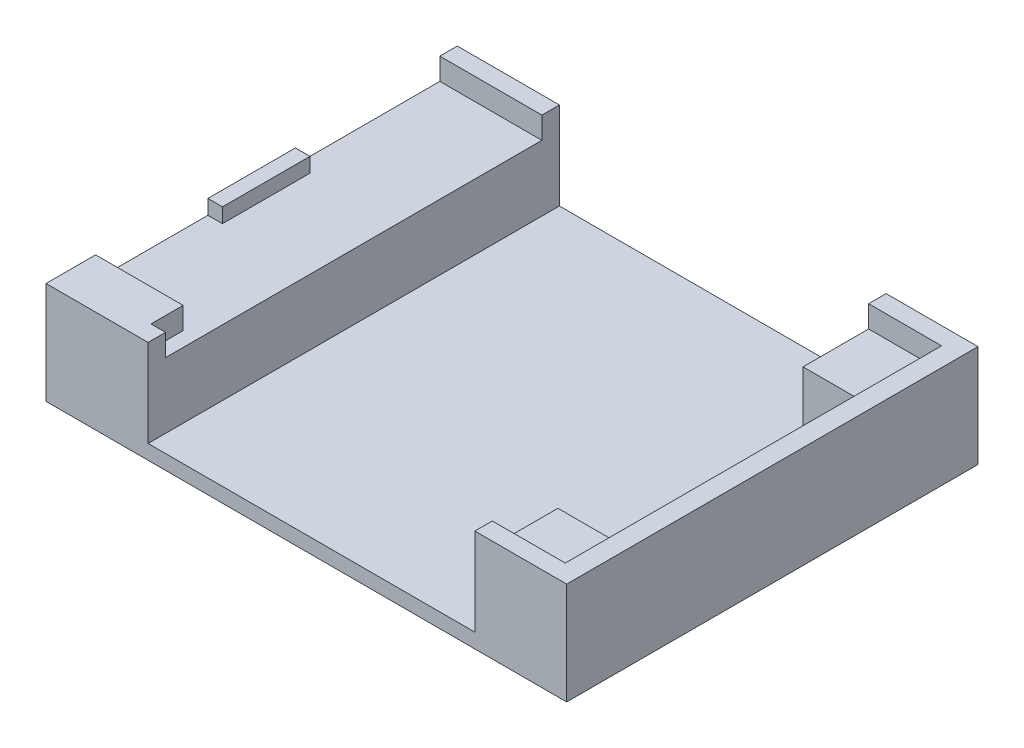
ISO-10303-21;
HEADER;
FILE_DESCRIPTION(('STEP AP214'),'2;1');
FILE_NAME('part.step','',(''),(''),'','','');
FILE_SCHEMA(('AUTOMOTIVE_DESIGN { 1 0 10303 214 1 1 1 1 }'));
ENDSEC;
DATA;
#1=APPLICATION_CONTEXT('core data for automotive mechanical design processes');
#2=APPLICATION_PROTOCOL_DEFINITION('international standard','automotive_design',2000,#1);
#3=PRODUCT_CONTEXT('',#1,'mechanical');
#4=PRODUCT('Part','Part','',(#3));
#5=PRODUCT_RELATED_PRODUCT_CATEGORY('part','',(#4));
#6=PRODUCT_DEFINITION_FORMATION('','',#4);
#7=PRODUCT_DEFINITION_CONTEXT('part definition',#1,'design');
#8=PRODUCT_DEFINITION('design','',#6,#7);
#9=PRODUCT_DEFINITION_SHAPE('','',#8);
#10=(LENGTH_UNIT() NAMED_UNIT(*) SI_UNIT(.MILLI.,.METRE.));
#11=(NAMED_UNIT(*) PLANE_ANGLE_UNIT() SI_UNIT($,.RADIAN.));
#12=(NAMED_UNIT(*) SI_UNIT($,.STERADIAN.) SOLID_ANGLE_UNIT());
#13=UNCERTAINTY_MEASURE_WITH_UNIT(LENGTH_MEASURE(1.E-05),#10,'distance_accuracy_value','');
#14=(GEOMETRIC_REPRESENTATION_CONTEXT(3) GLOBAL_UNCERTAINTY_ASSIGNED_CONTEXT((#13)) GLOBAL_UNIT_ASSIGNED_CONTEXT((#10,
#11,#12)) REPRESENTATION_CONTEXT('',''));
#15=CARTESIAN_POINT('',(0.,0.,0.));
#16=DIRECTION('',(0.,0.,1.));
#17=DIRECTION('',(1.,0.,0.));
#18=AXIS2_PLACEMENT_3D('',#15,#16,#17);
#19=CARTESIAN_POINT('',(0.,5.5,0.));
#20=DIRECTION('',(0.,1.,0.));
#21=DIRECTION('',(0.,0.,1.));
#22=AXIS2_PLACEMENT_3D('',#19,#20,#21);
#23=PLANE('',#22);
#24=DIRECTION('',(-1.,0.,0.));
#25=VECTOR('',#24,1.);
#26=CARTESIAN_POINT('',(-11.85,5.5,10.7));
#27=LINE('',#26,#25);
#28=CARTESIAN_POINT('',(-11.85,5.5,10.7));
#29=VERTEX_POINT('',#28);
#30=CARTESIAN_POINT('',(-17.85,5.5,10.7));
#31=VERTEX_POINT('',#30);
#32=EDGE_CURVE('E81',#29,#31,#27,.T.);
#33=ORIENTED_EDGE('',*,*,#32,.F.);
#34=DIRECTION('',(0.,0.,-1.));
#35=VECTOR('',#34,1.);
#36=CARTESIAN_POINT('',(-11.85,5.5,12.9));
#37=LINE('',#36,#35);
#38=CARTESIAN_POINT('',(-11.85,5.5,12.9));
#39=VERTEX_POINT('',#38);
#40=EDGE_CURVE('E85',#39,#29,#37,.T.);
#41=ORIENTED_EDGE('',*,*,#40,.F.);
#42=DIRECTION('',(1.,0.,0.));
#43=VECTOR('',#42,1.);
#44=CARTESIAN_POINT('',(-17.85,5.5,12.9));
#45=LINE('',#44,#43);
#46=CARTESIAN_POINT('',(-10.85,5.5,12.9));
#47=VERTEX_POINT('',#46);
#48=EDGE_CURVE('E368',#39,#47,#45,.T.);
#49=ORIENTED_EDGE('',*,*,#48,.T.);
#50=DIRECTION('',(0.,0.,1.));
#51=VECTOR('',#50,1.);
#52=CARTESIAN_POINT('',(-10.85,5.5,-12.9));
#53=LINE('',#52,#51);
#54=CARTESIAN_POINT('',(-10.85,5.5,-12.9));
#55=VERTEX_POINT('',#54);
#56=EDGE_CURVE('E327',#55,#47,#53,.T.);
#57=ORIENTED_EDGE('',*,*,#56,.F.);
#58=DIRECTION('',(-1.,0.,0.));
#59=VECTOR('',#58,1.);
#60=CARTESIAN_POINT('',(-17.85,5.5,-12.9));
#61=LINE('',#60,#59);
#62=CARTESIAN_POINT('',(-17.85,5.5,-12.9));
#63=VERTEX_POINT('',#62);
#64=EDGE_CURVE('E374',#55,#63,#61,.T.);
#65=ORIENTED_EDGE('',*,*,#64,.T.);
#66=DIRECTION('',(0.,0.,1.));
#67=VECTOR('',#66,1.);
#68=CARTESIAN_POINT('',(-17.85,5.5,-12.9));
#69=LINE('',#68,#67);
#70=CARTESIAN_POINT('',(-17.85,5.5,-3.));
#71=VERTEX_POINT('',#70);
#72=EDGE_CURVE('E363',#63,#71,#69,.T.);
#73=ORIENTED_EDGE('',*,*,#72,.T.);
#74=DIRECTION('',(-1.,0.,0.));
#75=VECTOR('',#74,1.);
#76=CARTESIAN_POINT('',(-17.85,5.5,-3.));
#77=LINE('',#76,#75);
#78=CARTESIAN_POINT('',(-16.85,5.5,-3.));
#79=VERTEX_POINT('',#78);
#80=EDGE_CURVE('E269',#79,#71,#77,.T.);
#81=ORIENTED_EDGE('',*,*,#80,.F.);
#82=DIRECTION('',(0.,0.,-1.));
#83=VECTOR('',#82,1.);
#84=CARTESIAN_POINT('',(-16.85,5.5,-3.));
#85=LINE('',#84,#83);
#86=CARTESIAN_POINT('',(-16.85,5.5,3.));
#87=VERTEX_POINT('',#86);
#88=EDGE_CURVE('E277',#87,#79,#85,.T.);
#89=ORIENTED_EDGE('',*,*,#88,.F.);
#90=DIRECTION('',(1.,0.,0.));
#91=VECTOR('',#90,1.);
#92=CARTESIAN_POINT('',(-17.85,5.5,3.));
#93=LINE('',#92,#91);
#94=CARTESIAN_POINT('',(-17.85,5.5,3.));
#95=VERTEX_POINT('',#94);
#96=EDGE_CURVE('E264',#95,#87,#93,.T.);
#97=ORIENTED_EDGE('',*,*,#96,.F.);
#98=EDGE_CURVE('E367',#95,#31,#69,.T.);
#99=ORIENTED_EDGE('',*,*,#98,.T.);
#100=EDGE_LOOP('',(#33,#41,#49,#57,#65,#73,#81,#89,#97,#99));
#101=FACE_BOUND('',#100,.T.);
#102=ADVANCED_FACE('F66',(#101),#23,.T.);
#103=CARTESIAN_POINT('',(-17.85,5.5,12.9));
#104=DIRECTION('',(0.,0.,1.));
#105=DIRECTION('',(1.,0.,0.));
#106=AXIS2_PLACEMENT_3D('',#103,#104,#105);
#107=PLANE('',#106);
#108=DIRECTION('',(0.,-1.,0.));
#109=VECTOR('',#108,1.);
#110=CARTESIAN_POINT('',(-11.85,7.,12.9));
#111=LINE('',#110,#109);
#112=CARTESIAN_POINT('',(-11.85,7.,12.9));
#113=VERTEX_POINT('',#112);
#114=EDGE_CURVE('E253',#113,#39,#111,.T.);
#115=ORIENTED_EDGE('',*,*,#114,.F.);
#116=DIRECTION('',(1.,0.,0.));
#117=VECTOR('',#116,1.);
#118=CARTESIAN_POINT('',(-17.85,7.,12.9));
#119=LINE('',#118,#117);
#120=CARTESIAN_POINT('',(-10.85,7.,12.9));
#121=VERTEX_POINT('',#120);
#122=EDGE_CURVE('E245',#113,#121,#119,.T.);
#123=ORIENTED_EDGE('',*,*,#122,.T.);
#124=DIRECTION('',(0.,1.,0.));
#125=VECTOR('',#124,1.);
#126=CARTESIAN_POINT('',(-10.85,-21.4321198284959,12.9));
#127=LINE('',#126,#125);
#128=EDGE_CURVE('E314',#47,#121,#127,.T.);
#129=ORIENTED_EDGE('',*,*,#128,.F.);
#130=ORIENTED_EDGE('',*,*,#48,.F.);
#131=EDGE_LOOP('',(#115,#123,#129,#130));
#132=FACE_BOUND('',#131,.T.);
#133=ADVANCED_FACE('F492',(#132),#107,.F.);
#134=CARTESIAN_POINT('',(-17.85,7.,-14.1));
#135=DIRECTION('',(0.,0.,1.));
#136=DIRECTION('',(1.,0.,0.));
#137=AXIS2_PLACEMENT_3D('',#134,#135,#136);
#138=PLANE('',#137);
#139=DIRECTION('',(0.,1.,0.));
#140=VECTOR('',#139,1.);
#141=CARTESIAN_POINT('',(11.55,-21.4321198284959,-14.1));
#142=LINE('',#141,#140);
#143=CARTESIAN_POINT('',(11.55,1.,-14.1));
#144=VERTEX_POINT('',#143);
#145=CARTESIAN_POINT('',(11.55,7.,-14.1));
#146=VERTEX_POINT('',#145);
#147=EDGE_CURVE('E303',#144,#146,#142,.T.);
#148=ORIENTED_EDGE('',*,*,#147,.T.);
#149=DIRECTION('',(-1.,0.,0.));
#150=VECTOR('',#149,1.);
#151=CARTESIAN_POINT('',(-17.85,7.,-14.1));
#152=LINE('',#151,#150);
#153=CARTESIAN_POINT('',(17.85,7.,-14.1));
#154=VERTEX_POINT('',#153);
#155=EDGE_CURVE('E400',#154,#146,#152,.T.);
#156=ORIENTED_EDGE('',*,*,#155,.F.);
#157=DIRECTION('',(0.,-1.,0.));
#158=VECTOR('',#157,1.);
#159=CARTESIAN_POINT('',(17.85,7.,-14.1));
#160=LINE('',#159,#158);
#161=CARTESIAN_POINT('',(17.85,0.,-14.1));
#162=VERTEX_POINT('',#161);
#163=EDGE_CURVE('E13',#154,#162,#160,.T.);
#164=ORIENTED_EDGE('',*,*,#163,.T.);
#165=DIRECTION('',(-1.,0.,0.));
#166=VECTOR('',#165,1.);
#167=CARTESIAN_POINT('',(-17.85,0.,-14.1));
#168=LINE('',#167,#166);
#169=CARTESIAN_POINT('',(-17.85,0.,-14.1));
#170=VERTEX_POINT('',#169);
#171=EDGE_CURVE('E414',#162,#170,#168,.T.);
#172=ORIENTED_EDGE('',*,*,#171,.T.);
#173=DIRECTION('',(0.,-1.,0.));
#174=VECTOR('',#173,1.);
#175=CARTESIAN_POINT('',(-17.85,7.,-14.1));
#176=LINE('',#175,#174);
#177=CARTESIAN_POINT('',(-17.85,7.,-14.1));
#178=VERTEX_POINT('',#177);
#179=EDGE_CURVE('E74',#178,#170,#176,.T.);
#180=ORIENTED_EDGE('',*,*,#179,.F.);
#181=CARTESIAN_POINT('',(-10.85,7.,-14.1));
#182=VERTEX_POINT('',#181);
#183=EDGE_CURVE('E398',#182,#178,#152,.T.);
#184=ORIENTED_EDGE('',*,*,#183,.F.);
#185=DIRECTION('',(0.,1.,0.));
#186=VECTOR('',#185,1.);
#187=CARTESIAN_POINT('',(-10.85,-21.4321198284959,-14.1));
#188=LINE('',#187,#186);
#189=CARTESIAN_POINT('',(-10.85,1.,-14.1));
#190=VERTEX_POINT('',#189);
#191=EDGE_CURVE('E295',#190,#182,#188,.T.);
#192=ORIENTED_EDGE('',*,*,#191,.F.);
#193=DIRECTION('',(-1.,0.,0.));
#194=VECTOR('',#193,1.);
#195=CARTESIAN_POINT('',(-10.85,1.,-14.1));
#196=LINE('',#195,#194);
#197=EDGE_CURVE('E291',#144,#190,#196,.T.);
#198=ORIENTED_EDGE('',*,*,#197,.F.);
#199=EDGE_LOOP('',(#148,#156,#164,#172,#180,#184,#192,#198));
#200=FACE_BOUND('',#199,.T.);
#201=ADVANCED_FACE('F489',(#200),#138,.F.);
#202=CARTESIAN_POINT('',(0.,7.,0.));
#203=DIRECTION('',(0.,1.,0.));
#204=DIRECTION('',(0.,0.,1.));
#205=AXIS2_PLACEMENT_3D('',#202,#203,#204);
#206=PLANE('',#205);
#207=ORIENTED_EDGE('',*,*,#155,.T.);
#208=DIRECTION('',(0.,0.,1.));
#209=VECTOR('',#208,1.);
#210=CARTESIAN_POINT('',(11.55,7.,-12.9));
#211=LINE('',#210,#209);
#212=CARTESIAN_POINT('',(11.55,7.,-12.9));
#213=VERTEX_POINT('',#212);
#214=EDGE_CURVE('E298',#146,#213,#211,.T.);
#215=ORIENTED_EDGE('',*,*,#214,.T.);
#216=DIRECTION('',(-1.,0.,0.));
#217=VECTOR('',#216,1.);
#218=CARTESIAN_POINT('',(-17.85,7.,-12.9));
#219=LINE('',#218,#217);
#220=CARTESIAN_POINT('',(16.55,7.,-12.9));
#221=VERTEX_POINT('',#220);
#222=EDGE_CURVE('E384',#221,#213,#219,.T.);
#223=ORIENTED_EDGE('',*,*,#222,.F.);
#224=DIRECTION('',(0.,0.,-1.));
#225=VECTOR('',#224,1.);
#226=CARTESIAN_POINT('',(16.55,7.,-12.9));
#227=LINE('',#226,#225);
#228=CARTESIAN_POINT('',(16.55,7.,12.9));
#229=VERTEX_POINT('',#228);
#230=EDGE_CURVE('E380',#229,#221,#227,.T.);
#231=ORIENTED_EDGE('',*,*,#230,.F.);
#232=CARTESIAN_POINT('',(11.55,7.,12.9));
#233=VERTEX_POINT('',#232);
#234=EDGE_CURVE('E362',#233,#229,#119,.T.);
#235=ORIENTED_EDGE('',*,*,#234,.F.);
#236=DIRECTION('',(0.,0.,-1.));
#237=VECTOR('',#236,1.);
#238=CARTESIAN_POINT('',(11.55,7.,12.9));
#239=LINE('',#238,#237);
#240=CARTESIAN_POINT('',(11.55,7.,14.1));
#241=VERTEX_POINT('',#240);
#242=EDGE_CURVE('E311',#241,#233,#239,.T.);
#243=ORIENTED_EDGE('',*,*,#242,.F.);
#244=DIRECTION('',(1.,0.,0.));
#245=VECTOR('',#244,1.);
#246=CARTESIAN_POINT('',(-17.85,7.,14.1));
#247=LINE('',#246,#245);
#248=CARTESIAN_POINT('',(17.85,7.,14.1));
#249=VERTEX_POINT('',#248);
#250=EDGE_CURVE('E407',#241,#249,#247,.T.);
#251=ORIENTED_EDGE('',*,*,#250,.T.);
#252=DIRECTION('',(0.,0.,-1.));
#253=VECTOR('',#252,1.);
#254=CARTESIAN_POINT('',(17.85,7.,-14.1));
#255=LINE('',#254,#253);
#256=EDGE_CURVE('E395',#249,#154,#255,.T.);
#257=ORIENTED_EDGE('',*,*,#256,.T.);
#258=EDGE_LOOP('',(#207,#215,#223,#231,#235,#243,#251,#257));
#259=FACE_BOUND('',#258,.T.);
#260=ADVANCED_FACE('F445',(#259),#206,.T.);
#261=CARTESIAN_POINT('',(-10.85,7.,-12.9));
#262=VERTEX_POINT('',#261);
#263=CARTESIAN_POINT('',(-17.85,7.,-12.9));
#264=VERTEX_POINT('',#263);
#265=EDGE_CURVE('E383',#262,#264,#219,.T.);
#266=ORIENTED_EDGE('',*,*,#265,.F.);
#267=DIRECTION('',(0.,0.,-1.));
#268=VECTOR('',#267,1.);
#269=CARTESIAN_POINT('',(-10.85,7.,-12.9));
#270=LINE('',#269,#268);
#271=EDGE_CURVE('E290',#262,#182,#270,.T.);
#272=ORIENTED_EDGE('',*,*,#271,.T.);
#273=ORIENTED_EDGE('',*,*,#183,.T.);
#274=DIRECTION('',(0.,0.,1.));
#275=VECTOR('',#274,1.);
#276=CARTESIAN_POINT('',(-17.85,7.,-14.1));
#277=LINE('',#276,#275);
#278=EDGE_CURVE('E404',#178,#264,#277,.T.);
#279=ORIENTED_EDGE('',*,*,#278,.T.);
#280=EDGE_LOOP('',(#266,#272,#273,#279));
#281=FACE_BOUND('',#280,.T.);
#282=ADVANCED_FACE('F488',(#281),#206,.T.);
#283=CARTESIAN_POINT('',(-17.85,5.5,-12.9));
#284=DIRECTION('',(0.,0.,-1.));
#285=DIRECTION('',(-1.,0.,0.));
#286=AXIS2_PLACEMENT_3D('',#283,#284,#285);
#287=PLANE('',#286);
#288=DIRECTION('',(0.,1.,0.));
#289=VECTOR('',#288,1.);
#290=CARTESIAN_POINT('',(11.55,-21.4321198284959,-12.9));
#291=LINE('',#290,#289);
#292=CARTESIAN_POINT('',(11.55,5.5,-12.9));
#293=VERTEX_POINT('',#292);
#294=EDGE_CURVE('E306',#293,#213,#291,.T.);
#295=ORIENTED_EDGE('',*,*,#294,.F.);
#296=CARTESIAN_POINT('',(16.55,5.5,-12.9));
#297=VERTEX_POINT('',#296);
#298=EDGE_CURVE('E375',#297,#293,#61,.T.);
#299=ORIENTED_EDGE('',*,*,#298,.F.);
#300=DIRECTION('',(0.,1.,0.));
#301=VECTOR('',#300,1.);
#302=CARTESIAN_POINT('',(16.55,5.5,-12.9));
#303=LINE('',#302,#301);
#304=EDGE_CURVE('E391',#297,#221,#303,.T.);
#305=ORIENTED_EDGE('',*,*,#304,.T.);
#306=ORIENTED_EDGE('',*,*,#222,.T.);
#307=EDGE_LOOP('',(#295,#299,#305,#306));
#308=FACE_BOUND('',#307,.T.);
#309=ADVANCED_FACE('F541',(#308),#287,.F.);
#310=DIRECTION('',(0.,1.,0.));
#311=VECTOR('',#310,1.);
#312=CARTESIAN_POINT('',(-10.85,-21.4321198284959,-12.9));
#313=LINE('',#312,#311);
#314=EDGE_CURVE('E301',#55,#262,#313,.T.);
#315=ORIENTED_EDGE('',*,*,#314,.T.);
#316=ORIENTED_EDGE('',*,*,#265,.T.);
#317=DIRECTION('',(0.,1.,0.));
#318=VECTOR('',#317,1.);
#319=CARTESIAN_POINT('',(-17.85,5.5,-12.9));
#320=LINE('',#319,#318);
#321=EDGE_CURVE('E387',#63,#264,#320,.T.);
#322=ORIENTED_EDGE('',*,*,#321,.F.);
#323=ORIENTED_EDGE('',*,*,#64,.F.);
#324=EDGE_LOOP('',(#315,#316,#322,#323));
#325=FACE_BOUND('',#324,.T.);
#326=ADVANCED_FACE('F485',(#325),#287,.F.);
#327=DIRECTION('',(0.,0.,1.));
#328=VECTOR('',#327,1.);
#329=CARTESIAN_POINT('',(-10.85,7.,12.9));
#330=LINE('',#329,#328);
#331=CARTESIAN_POINT('',(-10.85,7.,14.1));
#332=VERTEX_POINT('',#331);
#333=EDGE_CURVE('E294',#121,#332,#330,.T.);
#334=ORIENTED_EDGE('',*,*,#333,.F.);
#335=ORIENTED_EDGE('',*,*,#122,.F.);
#336=DIRECTION('',(0.,0.,-1.));
#337=VECTOR('',#336,1.);
#338=CARTESIAN_POINT('',(-11.85,7.,12.9));
#339=LINE('',#338,#337);
#340=CARTESIAN_POINT('',(-11.85,7.,10.7));
#341=VERTEX_POINT('',#340);
#342=EDGE_CURVE('E238',#113,#341,#339,.T.);
#343=ORIENTED_EDGE('',*,*,#342,.T.);
#344=DIRECTION('',(-1.,0.,0.));
#345=VECTOR('',#344,1.);
#346=CARTESIAN_POINT('',(-11.85,7.,10.7));
#347=LINE('',#346,#345);
#348=CARTESIAN_POINT('',(-17.85,7.,10.7));
#349=VERTEX_POINT('',#348);
#350=EDGE_CURVE('E243',#341,#349,#347,.T.);
#351=ORIENTED_EDGE('',*,*,#350,.T.);
#352=CARTESIAN_POINT('',(-17.85,7.,14.1));
#353=VERTEX_POINT('',#352);
#354=EDGE_CURVE('E403',#349,#353,#277,.T.);
#355=ORIENTED_EDGE('',*,*,#354,.T.);
#356=EDGE_CURVE('E408',#353,#332,#247,.T.);
#357=ORIENTED_EDGE('',*,*,#356,.T.);
#358=EDGE_LOOP('',(#334,#335,#343,#351,#355,#357));
#359=FACE_BOUND('',#358,.T.);
#360=ADVANCED_FACE('F241',(#359),#206,.T.);
#361=DIRECTION('',(0.,0.,-1.));
#362=VECTOR('',#361,1.);
#363=CARTESIAN_POINT('',(11.55,5.5,-8.39999999999998));
#364=LINE('',#363,#362);
#365=CARTESIAN_POINT('',(11.55,5.5,-8.39999999999998));
#366=VERTEX_POINT('',#365);
#367=EDGE_CURVE('E351',#366,#293,#364,.T.);
#368=ORIENTED_EDGE('',*,*,#367,.F.);
#369=DIRECTION('',(-1.,0.,0.));
#370=VECTOR('',#369,1.);
#371=CARTESIAN_POINT('',(16.55,5.5,-8.39999999999998));
#372=LINE('',#371,#370);
#373=CARTESIAN_POINT('',(16.55,5.5,-8.39999999999998));
#374=VERTEX_POINT('',#373);
#375=EDGE_CURVE('E348',#374,#366,#372,.T.);
#376=ORIENTED_EDGE('',*,*,#375,.F.);
#377=DIRECTION('',(0.,0.,-1.));
#378=VECTOR('',#377,1.);
#379=CARTESIAN_POINT('',(16.55,5.5,-12.9));
#380=LINE('',#379,#378);
#381=EDGE_CURVE('E370',#374,#297,#380,.T.);
#382=ORIENTED_EDGE('',*,*,#381,.T.);
#383=ORIENTED_EDGE('',*,*,#298,.T.);
#384=EDGE_LOOP('',(#368,#376,#382,#383));
#385=FACE_BOUND('',#384,.T.);
#386=ADVANCED_FACE('F501',(#385),#23,.T.);
#387=DIRECTION('',(1.,0.,0.));
#388=VECTOR('',#387,1.);
#389=CARTESIAN_POINT('',(11.55,5.5,8.40000000000001));
#390=LINE('',#389,#388);
#391=CARTESIAN_POINT('',(11.55,5.5,8.40000000000001));
#392=VERTEX_POINT('',#391);
#393=CARTESIAN_POINT('',(16.55,5.5,8.40000000000001));
#394=VERTEX_POINT('',#393);
#395=EDGE_CURVE('E345',#392,#394,#390,.T.);
#396=ORIENTED_EDGE('',*,*,#395,.F.);
#397=DIRECTION('',(0.,0.,-1.));
#398=VECTOR('',#397,1.);
#399=CARTESIAN_POINT('',(11.55,5.5,12.9));
#400=LINE('',#399,#398);
#401=CARTESIAN_POINT('',(11.55,5.5,12.9));
#402=VERTEX_POINT('',#401);
#403=EDGE_CURVE('E342',#402,#392,#400,.T.);
#404=ORIENTED_EDGE('',*,*,#403,.F.);
#405=CARTESIAN_POINT('',(16.55,5.5,12.9));
#406=VERTEX_POINT('',#405);
#407=EDGE_CURVE('E366',#402,#406,#45,.T.);
#408=ORIENTED_EDGE('',*,*,#407,.T.);
#409=EDGE_CURVE('E371',#406,#394,#380,.T.);
#410=ORIENTED_EDGE('',*,*,#409,.T.);
#411=EDGE_LOOP('',(#396,#404,#408,#410));
#412=FACE_BOUND('',#411,.T.);
#413=ADVANCED_FACE('F502',(#412),#23,.T.);
#414=CARTESIAN_POINT('',(17.85,7.,-14.1));
#415=DIRECTION('',(-1.,0.,0.));
#416=DIRECTION('',(0.,0.,1.));
#417=AXIS2_PLACEMENT_3D('',#414,#415,#416);
#418=PLANE('',#417);
#419=DIRECTION('',(0.,0.,-1.));
#420=VECTOR('',#419,1.);
#421=CARTESIAN_POINT('',(17.85,0.,-14.1));
#422=LINE('',#421,#420);
#423=CARTESIAN_POINT('',(17.85,0.,14.1));
#424=VERTEX_POINT('',#423);
#425=EDGE_CURVE('E390',#424,#162,#422,.T.);
#426=ORIENTED_EDGE('',*,*,#425,.T.);
#427=ORIENTED_EDGE('',*,*,#163,.F.);
#428=ORIENTED_EDGE('',*,*,#256,.F.);
#429=DIRECTION('',(0.,-1.,0.));
#430=VECTOR('',#429,1.);
#431=CARTESIAN_POINT('',(17.85,7.,14.1));
#432=LINE('',#431,#430);
#433=EDGE_CURVE('E411',#249,#424,#432,.T.);
#434=ORIENTED_EDGE('',*,*,#433,.T.);
#435=EDGE_LOOP('',(#426,#427,#428,#434));
#436=FACE_BOUND('',#435,.T.);
#437=ADVANCED_FACE('F68',(#436),#418,.F.);
#438=CARTESIAN_POINT('',(-17.85,7.,-14.1));
#439=DIRECTION('',(1.,0.,0.));
#440=DIRECTION('',(0.,0.,-1.));
#441=AXIS2_PLACEMENT_3D('',#438,#439,#440);
#442=PLANE('',#441);
#443=ORIENTED_EDGE('',*,*,#354,.F.);
#444=DIRECTION('',(0.,-1.,0.));
#445=VECTOR('',#444,1.);
#446=CARTESIAN_POINT('',(-17.85,7.,10.7));
#447=LINE('',#446,#445);
#448=EDGE_CURVE('E254',#349,#31,#447,.T.);
#449=ORIENTED_EDGE('',*,*,#448,.T.);
#450=ORIENTED_EDGE('',*,*,#98,.F.);
#451=DIRECTION('',(0.,-1.,0.));
#452=VECTOR('',#451,1.);
#453=CARTESIAN_POINT('',(-17.85,6.5,3.));
#454=LINE('',#453,#452);
#455=CARTESIAN_POINT('',(-17.85,6.5,3.));
#456=VERTEX_POINT('',#455);
#457=EDGE_CURVE('E288',#456,#95,#454,.T.);
#458=ORIENTED_EDGE('',*,*,#457,.F.);
#459=DIRECTION('',(0.,0.,1.));
#460=VECTOR('',#459,1.);
#461=CARTESIAN_POINT('',(-17.85,6.5,-3.));
#462=LINE('',#461,#460);
#463=CARTESIAN_POINT('',(-17.85,6.5,-3.));
#464=VERTEX_POINT('',#463);
#465=EDGE_CURVE('E265',#464,#456,#462,.T.);
#466=ORIENTED_EDGE('',*,*,#465,.F.);
#467=DIRECTION('',(0.,-1.,0.));
#468=VECTOR('',#467,1.);
#469=CARTESIAN_POINT('',(-17.85,6.5,-3.));
#470=LINE('',#469,#468);
#471=EDGE_CURVE('E275',#464,#71,#470,.T.);
#472=ORIENTED_EDGE('',*,*,#471,.T.);
#473=ORIENTED_EDGE('',*,*,#72,.F.);
#474=ORIENTED_EDGE('',*,*,#321,.T.);
#475=ORIENTED_EDGE('',*,*,#278,.F.);
#476=ORIENTED_EDGE('',*,*,#179,.T.);
#477=DIRECTION('',(0.,0.,1.));
#478=VECTOR('',#477,1.);
#479=CARTESIAN_POINT('',(-17.85,0.,-14.1));
#480=LINE('',#479,#478);
#481=CARTESIAN_POINT('',(-17.85,0.,14.1));
#482=VERTEX_POINT('',#481);
#483=EDGE_CURVE('E416',#170,#482,#480,.T.);
#484=ORIENTED_EDGE('',*,*,#483,.T.);
#485=DIRECTION('',(0.,-1.,0.));
#486=VECTOR('',#485,1.);
#487=CARTESIAN_POINT('',(-17.85,7.,14.1));
#488=LINE('',#487,#486);
#489=EDGE_CURVE('E421',#353,#482,#488,.T.);
#490=ORIENTED_EDGE('',*,*,#489,.F.);
#491=EDGE_LOOP('',(#443,#449,#450,#458,#466,#472,#473,#474,#475,#476,#484,#490));
#492=FACE_BOUND('',#491,.T.);
#493=ADVANCED_FACE('F428',(#492),#442,.F.);
#494=CARTESIAN_POINT('',(-17.85,7.,14.1));
#495=DIRECTION('',(0.,0.,-1.));
#496=DIRECTION('',(-1.,0.,0.));
#497=AXIS2_PLACEMENT_3D('',#494,#495,#496);
#498=PLANE('',#497);
#499=DIRECTION('',(-1.,0.,0.));
#500=VECTOR('',#499,1.);
#501=CARTESIAN_POINT('',(-10.85,1.,14.1));
#502=LINE('',#501,#500);
#503=CARTESIAN_POINT('',(11.55,1.,14.1));
#504=VERTEX_POINT('',#503);
#505=CARTESIAN_POINT('',(-10.85,1.,14.1));
#506=VERTEX_POINT('',#505);
#507=EDGE_CURVE('E317',#504,#506,#502,.T.);
#508=ORIENTED_EDGE('',*,*,#507,.T.);
#509=DIRECTION('',(0.,1.,0.));
#510=VECTOR('',#509,1.);
#511=CARTESIAN_POINT('',(-10.85,-21.4321198284959,14.1));
#512=LINE('',#511,#510);
#513=EDGE_CURVE('E313',#506,#332,#512,.T.);
#514=ORIENTED_EDGE('',*,*,#513,.T.);
#515=ORIENTED_EDGE('',*,*,#356,.F.);
#516=ORIENTED_EDGE('',*,*,#489,.T.);
#517=DIRECTION('',(1.,0.,0.));
#518=VECTOR('',#517,1.);
#519=CARTESIAN_POINT('',(-17.85,0.,14.1));
#520=LINE('',#519,#518);
#521=EDGE_CURVE('E399',#482,#424,#520,.T.);
#522=ORIENTED_EDGE('',*,*,#521,.T.);
#523=ORIENTED_EDGE('',*,*,#433,.F.);
#524=ORIENTED_EDGE('',*,*,#250,.F.);
#525=DIRECTION('',(0.,1.,0.));
#526=VECTOR('',#525,1.);
#527=CARTESIAN_POINT('',(11.55,-21.4321198284959,14.1));
#528=LINE('',#527,#526);
#529=EDGE_CURVE('E321',#504,#241,#528,.T.);
#530=ORIENTED_EDGE('',*,*,#529,.F.);
#531=EDGE_LOOP('',(#508,#514,#515,#516,#522,#523,#524,#530));
#532=FACE_BOUND('',#531,.T.);
#533=ADVANCED_FACE('F438',(#532),#498,.F.);
#534=CARTESIAN_POINT('',(0.,0.,0.));
#535=DIRECTION('',(0.,1.,0.));
#536=DIRECTION('',(0.,0.,1.));
#537=AXIS2_PLACEMENT_3D('',#534,#535,#536);
#538=PLANE('',#537);
#539=ORIENTED_EDGE('',*,*,#425,.F.);
#540=ORIENTED_EDGE('',*,*,#521,.F.);
#541=ORIENTED_EDGE('',*,*,#483,.F.);
#542=ORIENTED_EDGE('',*,*,#171,.F.);
#543=EDGE_LOOP('',(#539,#540,#541,#542));
#544=FACE_BOUND('',#543,.T.);
#545=ADVANCED_FACE('F435',(#544),#538,.F.);
#546=CARTESIAN_POINT('',(16.55,5.5,-12.9));
#547=DIRECTION('',(1.,0.,0.));
#548=DIRECTION('',(0.,0.,-1.));
#549=AXIS2_PLACEMENT_3D('',#546,#547,#548);
#550=PLANE('',#549);
#551=ORIENTED_EDGE('',*,*,#230,.T.);
#552=ORIENTED_EDGE('',*,*,#304,.F.);
#553=ORIENTED_EDGE('',*,*,#381,.F.);
#554=DIRECTION('',(0.,1.,0.));
#555=VECTOR('',#554,1.);
#556=CARTESIAN_POINT('',(16.55,-37.6350900091922,-8.39999999999998));
#557=LINE('',#556,#555);
#558=CARTESIAN_POINT('',(16.55,1.,-8.39999999999998));
#559=VERTEX_POINT('',#558);
#560=EDGE_CURVE('E356',#559,#374,#557,.T.);
#561=ORIENTED_EDGE('',*,*,#560,.F.);
#562=DIRECTION('',(0.,0.,1.));
#563=VECTOR('',#562,1.);
#564=CARTESIAN_POINT('',(16.55,1.,8.40000000000001));
#565=LINE('',#564,#563);
#566=CARTESIAN_POINT('',(16.55,1.,8.40000000000001));
#567=VERTEX_POINT('',#566);
#568=EDGE_CURVE('E333',#559,#567,#565,.T.);
#569=ORIENTED_EDGE('',*,*,#568,.T.);
#570=DIRECTION('',(0.,1.,0.));
#571=VECTOR('',#570,1.);
#572=CARTESIAN_POINT('',(16.55,-37.6350900091922,8.40000000000001));
#573=LINE('',#572,#571);
#574=EDGE_CURVE('E358',#567,#394,#573,.T.);
#575=ORIENTED_EDGE('',*,*,#574,.T.);
#576=ORIENTED_EDGE('',*,*,#409,.F.);
#577=DIRECTION('',(0.,1.,0.));
#578=VECTOR('',#577,1.);
#579=CARTESIAN_POINT('',(16.55,5.5,12.9));
#580=LINE('',#579,#578);
#581=EDGE_CURVE('E378',#406,#229,#580,.T.);
#582=ORIENTED_EDGE('',*,*,#581,.T.);
#583=EDGE_LOOP('',(#551,#552,#553,#561,#569,#575,#576,#582));
#584=FACE_BOUND('',#583,.T.);
#585=ADVANCED_FACE('F507',(#584),#550,.F.);
#586=ORIENTED_EDGE('',*,*,#407,.F.);
#587=DIRECTION('',(0.,1.,0.));
#588=VECTOR('',#587,1.);
#589=CARTESIAN_POINT('',(11.55,-21.4321198284959,12.9));
#590=LINE('',#589,#588);
#591=EDGE_CURVE('E318',#402,#233,#590,.T.);
#592=ORIENTED_EDGE('',*,*,#591,.T.);
#593=ORIENTED_EDGE('',*,*,#234,.T.);
#594=ORIENTED_EDGE('',*,*,#581,.F.);
#595=EDGE_LOOP('',(#586,#592,#593,#594));
#596=FACE_BOUND('',#595,.T.);
#597=ADVANCED_FACE('F495',(#596),#107,.F.);
#598=CARTESIAN_POINT('',(11.55,-37.6350900091922,-8.39999999999998));
#599=DIRECTION('',(1.,0.,0.));
#600=DIRECTION('',(0.,0.,-1.));
#601=AXIS2_PLACEMENT_3D('',#598,#599,#600);
#602=PLANE('',#601);
#603=DIRECTION('',(0.,0.,1.));
#604=VECTOR('',#603,1.);
#605=CARTESIAN_POINT('',(11.55,1.,-8.39999999999998));
#606=LINE('',#605,#604);
#607=CARTESIAN_POINT('',(11.55,1.,-8.39999999999998));
#608=VERTEX_POINT('',#607);
#609=EDGE_CURVE('E337',#144,#608,#606,.T.);
#610=ORIENTED_EDGE('',*,*,#609,.T.);
#611=DIRECTION('',(0.,1.,0.));
#612=VECTOR('',#611,1.);
#613=CARTESIAN_POINT('',(11.55,-37.6350900091922,-8.39999999999998));
#614=LINE('',#613,#612);
#615=EDGE_CURVE('E331',#608,#366,#614,.T.);
#616=ORIENTED_EDGE('',*,*,#615,.T.);
#617=ORIENTED_EDGE('',*,*,#367,.T.);
#618=ORIENTED_EDGE('',*,*,#294,.T.);
#619=ORIENTED_EDGE('',*,*,#214,.F.);
#620=ORIENTED_EDGE('',*,*,#147,.F.);
#621=EDGE_LOOP('',(#610,#616,#617,#618,#619,#620));
#622=FACE_BOUND('',#621,.T.);
#623=ADVANCED_FACE('F506',(#622),#602,.F.);
#624=CARTESIAN_POINT('',(16.55,-37.6350900091922,-8.39999999999998));
#625=DIRECTION('',(0.,0.,-1.));
#626=DIRECTION('',(-1.,0.,0.));
#627=AXIS2_PLACEMENT_3D('',#624,#625,#626);
#628=PLANE('',#627);
#629=DIRECTION('',(1.,0.,0.));
#630=VECTOR('',#629,1.);
#631=CARTESIAN_POINT('',(16.55,1.,-8.39999999999998));
#632=LINE('',#631,#630);
#633=EDGE_CURVE('E335',#608,#559,#632,.T.);
#634=ORIENTED_EDGE('',*,*,#633,.T.);
#635=ORIENTED_EDGE('',*,*,#560,.T.);
#636=ORIENTED_EDGE('',*,*,#375,.T.);
#637=ORIENTED_EDGE('',*,*,#615,.F.);
#638=EDGE_LOOP('',(#634,#635,#636,#637));
#639=FACE_BOUND('',#638,.T.);
#640=ADVANCED_FACE('F513',(#639),#628,.F.);
#641=CARTESIAN_POINT('',(11.55,-37.6350900091922,8.40000000000001));
#642=DIRECTION('',(0.,0.,1.));
#643=DIRECTION('',(1.,0.,0.));
#644=AXIS2_PLACEMENT_3D('',#641,#642,#643);
#645=PLANE('',#644);
#646=DIRECTION('',(-1.,0.,0.));
#647=VECTOR('',#646,1.);
#648=CARTESIAN_POINT('',(11.55,1.,8.40000000000001));
#649=LINE('',#648,#647);
#650=CARTESIAN_POINT('',(11.55,1.,8.40000000000001));
#651=VERTEX_POINT('',#650);
#652=EDGE_CURVE('E330',#567,#651,#649,.T.);
#653=ORIENTED_EDGE('',*,*,#652,.T.);
#654=DIRECTION('',(0.,1.,0.));
#655=VECTOR('',#654,1.);
#656=CARTESIAN_POINT('',(11.55,-37.6350900091922,8.40000000000001));
#657=LINE('',#656,#655);
#658=EDGE_CURVE('E354',#651,#392,#657,.T.);
#659=ORIENTED_EDGE('',*,*,#658,.T.);
#660=ORIENTED_EDGE('',*,*,#395,.T.);
#661=ORIENTED_EDGE('',*,*,#574,.F.);
#662=EDGE_LOOP('',(#653,#659,#660,#661));
#663=FACE_BOUND('',#662,.T.);
#664=ADVANCED_FACE('F525',(#663),#645,.F.);
#665=CARTESIAN_POINT('',(11.55,-37.6350900091922,12.9));
#666=DIRECTION('',(1.,0.,0.));
#667=DIRECTION('',(0.,0.,-1.));
#668=AXIS2_PLACEMENT_3D('',#665,#666,#667);
#669=PLANE('',#668);
#670=DIRECTION('',(0.,0.,1.));
#671=VECTOR('',#670,1.);
#672=CARTESIAN_POINT('',(11.55,1.,12.9));
#673=LINE('',#672,#671);
#674=EDGE_CURVE('E328',#651,#504,#673,.T.);
#675=ORIENTED_EDGE('',*,*,#674,.T.);
#676=ORIENTED_EDGE('',*,*,#529,.T.);
#677=ORIENTED_EDGE('',*,*,#242,.T.);
#678=ORIENTED_EDGE('',*,*,#591,.F.);
#679=ORIENTED_EDGE('',*,*,#403,.T.);
#680=ORIENTED_EDGE('',*,*,#658,.F.);
#681=EDGE_LOOP('',(#675,#676,#677,#678,#679,#680));
#682=FACE_BOUND('',#681,.T.);
#683=ADVANCED_FACE('F451',(#682),#669,.F.);
#684=CARTESIAN_POINT('',(-10.85,-37.6350900091922,-12.9));
#685=DIRECTION('',(-1.,0.,0.));
#686=DIRECTION('',(0.,0.,1.));
#687=AXIS2_PLACEMENT_3D('',#684,#685,#686);
#688=PLANE('',#687);
#689=DIRECTION('',(0.,0.,-1.));
#690=VECTOR('',#689,1.);
#691=CARTESIAN_POINT('',(-10.85,1.,-12.9));
#692=LINE('',#691,#690);
#693=EDGE_CURVE('E339',#506,#190,#692,.T.);
#694=ORIENTED_EDGE('',*,*,#693,.T.);
#695=ORIENTED_EDGE('',*,*,#191,.T.);
#696=ORIENTED_EDGE('',*,*,#271,.F.);
#697=ORIENTED_EDGE('',*,*,#314,.F.);
#698=ORIENTED_EDGE('',*,*,#56,.T.);
#699=ORIENTED_EDGE('',*,*,#128,.T.);
#700=ORIENTED_EDGE('',*,*,#333,.T.);
#701=ORIENTED_EDGE('',*,*,#513,.F.);
#702=EDGE_LOOP('',(#694,#695,#696,#697,#698,#699,#700,#701));
#703=FACE_BOUND('',#702,.T.);
#704=ADVANCED_FACE('F461',(#703),#688,.F.);
#705=CARTESIAN_POINT('',(0.,1.,0.));
#706=DIRECTION('',(0.,1.,0.));
#707=DIRECTION('',(0.,0.,1.));
#708=AXIS2_PLACEMENT_3D('',#705,#706,#707);
#709=PLANE('',#708);
#710=ORIENTED_EDGE('',*,*,#609,.F.);
#711=ORIENTED_EDGE('',*,*,#197,.T.);
#712=ORIENTED_EDGE('',*,*,#693,.F.);
#713=ORIENTED_EDGE('',*,*,#507,.F.);
#714=ORIENTED_EDGE('',*,*,#674,.F.);
#715=ORIENTED_EDGE('',*,*,#652,.F.);
#716=ORIENTED_EDGE('',*,*,#568,.F.);
#717=ORIENTED_EDGE('',*,*,#633,.F.);
#718=EDGE_LOOP('',(#710,#711,#712,#713,#714,#715,#716,#717));
#719=FACE_BOUND('',#718,.T.);
#720=ADVANCED_FACE('F456',(#719),#709,.T.);
#721=CARTESIAN_POINT('',(-17.85,6.5,3.));
#722=DIRECTION('',(0.,0.,-1.));
#723=DIRECTION('',(-1.,0.,0.));
#724=AXIS2_PLACEMENT_3D('',#721,#722,#723);
#725=PLANE('',#724);
#726=ORIENTED_EDGE('',*,*,#96,.T.);
#727=DIRECTION('',(0.,-1.,0.));
#728=VECTOR('',#727,1.);
#729=CARTESIAN_POINT('',(-16.85,6.5,3.));
#730=LINE('',#729,#728);
#731=CARTESIAN_POINT('',(-16.85,6.5,3.));
#732=VERTEX_POINT('',#731);
#733=EDGE_CURVE('E285',#732,#87,#730,.T.);
#734=ORIENTED_EDGE('',*,*,#733,.F.);
#735=DIRECTION('',(1.,0.,0.));
#736=VECTOR('',#735,1.);
#737=CARTESIAN_POINT('',(-17.85,6.5,3.));
#738=LINE('',#737,#736);
#739=EDGE_CURVE('E268',#456,#732,#738,.T.);
#740=ORIENTED_EDGE('',*,*,#739,.F.);
#741=ORIENTED_EDGE('',*,*,#457,.T.);
#742=EDGE_LOOP('',(#726,#734,#740,#741));
#743=FACE_BOUND('',#742,.T.);
#744=ADVANCED_FACE('F470',(#743),#725,.F.);
#745=CARTESIAN_POINT('',(-16.85,6.5,-3.));
#746=DIRECTION('',(-1.,0.,0.));
#747=DIRECTION('',(0.,0.,1.));
#748=AXIS2_PLACEMENT_3D('',#745,#746,#747);
#749=PLANE('',#748);
#750=ORIENTED_EDGE('',*,*,#88,.T.);
#751=DIRECTION('',(0.,-1.,0.));
#752=VECTOR('',#751,1.);
#753=CARTESIAN_POINT('',(-16.85,6.5,-3.));
#754=LINE('',#753,#752);
#755=CARTESIAN_POINT('',(-16.85,6.5,-3.));
#756=VERTEX_POINT('',#755);
#757=EDGE_CURVE('E283',#756,#79,#754,.T.);
#758=ORIENTED_EDGE('',*,*,#757,.F.);
#759=DIRECTION('',(0.,0.,-1.));
#760=VECTOR('',#759,1.);
#761=CARTESIAN_POINT('',(-16.85,6.5,-3.));
#762=LINE('',#761,#760);
#763=EDGE_CURVE('E271',#732,#756,#762,.T.);
#764=ORIENTED_EDGE('',*,*,#763,.F.);
#765=ORIENTED_EDGE('',*,*,#733,.T.);
#766=EDGE_LOOP('',(#750,#758,#764,#765));
#767=FACE_BOUND('',#766,.T.);
#768=ADVANCED_FACE('F473',(#767),#749,.F.);
#769=CARTESIAN_POINT('',(-17.85,6.5,-3.));
#770=DIRECTION('',(0.,0.,1.));
#771=DIRECTION('',(1.,0.,0.));
#772=AXIS2_PLACEMENT_3D('',#769,#770,#771);
#773=PLANE('',#772);
#774=ORIENTED_EDGE('',*,*,#80,.T.);
#775=ORIENTED_EDGE('',*,*,#471,.F.);
#776=DIRECTION('',(-1.,0.,0.));
#777=VECTOR('',#776,1.);
#778=CARTESIAN_POINT('',(-17.85,6.5,-3.));
#779=LINE('',#778,#777);
#780=EDGE_CURVE('E273',#756,#464,#779,.T.);
#781=ORIENTED_EDGE('',*,*,#780,.F.);
#782=ORIENTED_EDGE('',*,*,#757,.T.);
#783=EDGE_LOOP('',(#774,#775,#781,#782));
#784=FACE_BOUND('',#783,.T.);
#785=ADVANCED_FACE('F563',(#784),#773,.F.);
#786=CARTESIAN_POINT('',(0.,6.5,0.));
#787=DIRECTION('',(0.,1.,0.));
#788=DIRECTION('',(0.,0.,1.));
#789=AXIS2_PLACEMENT_3D('',#786,#787,#788);
#790=PLANE('',#789);
#791=ORIENTED_EDGE('',*,*,#465,.T.);
#792=ORIENTED_EDGE('',*,*,#739,.T.);
#793=ORIENTED_EDGE('',*,*,#763,.T.);
#794=ORIENTED_EDGE('',*,*,#780,.T.);
#795=EDGE_LOOP('',(#791,#792,#793,#794));
#796=FACE_BOUND('',#795,.T.);
#797=ADVANCED_FACE('F477',(#796),#790,.T.);
#798=CARTESIAN_POINT('',(-11.85,7.,12.9));
#799=DIRECTION('',(-1.,0.,0.));
#800=DIRECTION('',(0.,0.,1.));
#801=AXIS2_PLACEMENT_3D('',#798,#799,#800);
#802=PLANE('',#801);
#803=ORIENTED_EDGE('',*,*,#40,.T.);
#804=DIRECTION('',(0.,-1.,0.));
#805=VECTOR('',#804,1.);
#806=CARTESIAN_POINT('',(-11.85,7.,10.7));
#807=LINE('',#806,#805);
#808=EDGE_CURVE('E250',#341,#29,#807,.T.);
#809=ORIENTED_EDGE('',*,*,#808,.F.);
#810=ORIENTED_EDGE('',*,*,#342,.F.);
#811=ORIENTED_EDGE('',*,*,#114,.T.);
#812=EDGE_LOOP('',(#803,#809,#810,#811));
#813=FACE_BOUND('',#812,.T.);
#814=ADVANCED_FACE('F251',(#813),#802,.F.);
#815=CARTESIAN_POINT('',(-11.85,7.,10.7));
#816=DIRECTION('',(0.,0.,1.));
#817=DIRECTION('',(1.,0.,0.));
#818=AXIS2_PLACEMENT_3D('',#815,#816,#817);
#819=PLANE('',#818);
#820=ORIENTED_EDGE('',*,*,#32,.T.);
#821=ORIENTED_EDGE('',*,*,#448,.F.);
#822=ORIENTED_EDGE('',*,*,#350,.F.);
#823=ORIENTED_EDGE('',*,*,#808,.T.);
#824=EDGE_LOOP('',(#820,#821,#822,#823));
#825=FACE_BOUND('',#824,.T.);
#826=ADVANCED_FACE('F256',(#825),#819,.F.);
#827=CLOSED_SHELL('',(#102,#133,#201,#260,#282,#309,#326,#360,#386,#413,#437,#493,#533,#545,
#585,#597,#623,#640,#664,#683,#704,#720,#744,#768,#785,#797,#814,#826));
#828=MANIFOLD_SOLID_BREP('B2',#827);
#829=ADVANCED_BREP_SHAPE_REPRESENTATION('',(#18,#828),#14);
#830=SHAPE_DEFINITION_REPRESENTATION(#9,#829);
ENDSEC;
END-ISO-10303-21;
